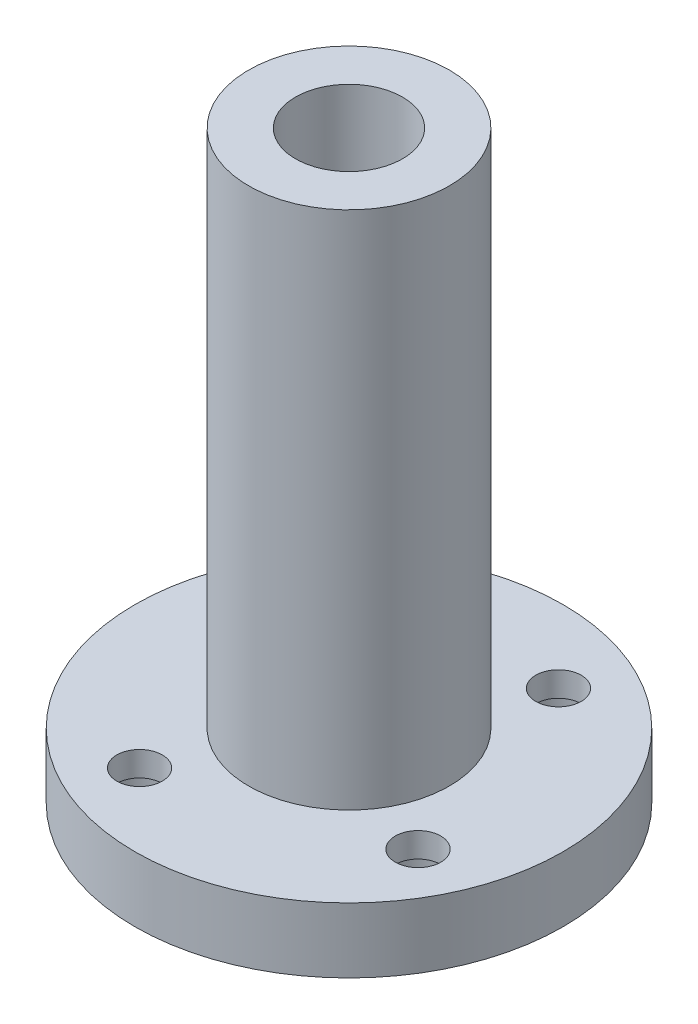
ISO-10303-21;
HEADER;
FILE_DESCRIPTION(('STEP AP214'),'2;1');
FILE_NAME('part.step','',(''),(''),'','','');
FILE_SCHEMA(('AUTOMOTIVE_DESIGN { 1 0 10303 214 1 1 1 1 }'));
ENDSEC;
DATA;
#1=APPLICATION_CONTEXT('core data for automotive mechanical design processes');
#2=APPLICATION_PROTOCOL_DEFINITION('international standard','automotive_design',2000,#1);
#3=PRODUCT_CONTEXT('',#1,'mechanical');
#4=PRODUCT('Part','Part','',(#3));
#5=PRODUCT_RELATED_PRODUCT_CATEGORY('part','',(#4));
#6=PRODUCT_DEFINITION_FORMATION('','',#4);
#7=PRODUCT_DEFINITION_CONTEXT('part definition',#1,'design');
#8=PRODUCT_DEFINITION('design','',#6,#7);
#9=PRODUCT_DEFINITION_SHAPE('','',#8);
#10=(LENGTH_UNIT() NAMED_UNIT(*) SI_UNIT(.MILLI.,.METRE.));
#11=(NAMED_UNIT(*) PLANE_ANGLE_UNIT() SI_UNIT($,.RADIAN.));
#12=(NAMED_UNIT(*) SI_UNIT($,.STERADIAN.) SOLID_ANGLE_UNIT());
#13=UNCERTAINTY_MEASURE_WITH_UNIT(LENGTH_MEASURE(1.E-05),#10,'distance_accuracy_value','');
#14=(GEOMETRIC_REPRESENTATION_CONTEXT(3) GLOBAL_UNCERTAINTY_ASSIGNED_CONTEXT((#13)) GLOBAL_UNIT_ASSIGNED_CONTEXT((#10,
#11,#12)) REPRESENTATION_CONTEXT('',''));
#15=CARTESIAN_POINT('',(0.,0.,0.));
#16=DIRECTION('',(0.,0.,1.));
#17=DIRECTION('',(1.,0.,0.));
#18=AXIS2_PLACEMENT_3D('',#15,#16,#17);
#19=CARTESIAN_POINT('',(-5.40292214632431,5.,10.7148696809974));
#20=DIRECTION('',(0.,-1.,0.));
#21=DIRECTION('',(0.,0.,-1.));
#22=AXIS2_PLACEMENT_3D('',#19,#20,#21);
#23=CYLINDRICAL_SURFACE('',#22,1.75);
#24=CARTESIAN_POINT('',(-5.40292214632431,5.,10.7148696809974));
#25=DIRECTION('',(0.,1.,0.));
#26=DIRECTION('',(0.,0.,1.));
#27=AXIS2_PLACEMENT_3D('',#24,#25,#26);
#28=CIRCLE('',#27,1.75);
#29=CARTESIAN_POINT('',(-5.40292214632431,5.,12.4648696809974));
#30=VERTEX_POINT('',#29);
#31=EDGE_CURVE('E49',#30,#30,#28,.T.);
#32=ORIENTED_EDGE('',*,*,#31,.T.);
#33=EDGE_LOOP('',(#32));
#34=FACE_BOUND('',#33,.T.);
#35=CARTESIAN_POINT('',(-5.40292214632431,3.1,10.7148696809974));
#36=DIRECTION('',(0.,-1.,0.));
#37=DIRECTION('',(0.,0.,-1.));
#38=AXIS2_PLACEMENT_3D('',#35,#36,#37);
#39=CIRCLE('',#38,1.75);
#40=CARTESIAN_POINT('',(-5.40292214632431,3.1,8.96486968099745));
#41=VERTEX_POINT('',#40);
#42=EDGE_CURVE('E40',#41,#41,#39,.T.);
#43=ORIENTED_EDGE('',*,*,#42,.T.);
#44=EDGE_LOOP('',(#43));
#45=FACE_BOUND('',#44,.T.);
#46=ADVANCED_FACE('F36',(#34,#45),#23,.F.);
#47=CARTESIAN_POINT('',(-10.7148696809974,5.,-5.40292214632435));
#48=DIRECTION('',(0.,-1.,0.));
#49=DIRECTION('',(0.,0.,-1.));
#50=AXIS2_PLACEMENT_3D('',#47,#48,#49);
#51=CYLINDRICAL_SURFACE('',#50,1.75);
#52=CARTESIAN_POINT('',(-10.7148696809974,5.,-5.40292214632435));
#53=DIRECTION('',(0.,1.,0.));
#54=DIRECTION('',(0.,0.,1.));
#55=AXIS2_PLACEMENT_3D('',#52,#53,#54);
#56=CIRCLE('',#55,1.75);
#57=CARTESIAN_POINT('',(-10.7148696809974,5.,-3.65292214632435));
#58=VERTEX_POINT('',#57);
#59=EDGE_CURVE('E86',#58,#58,#56,.T.);
#60=ORIENTED_EDGE('',*,*,#59,.T.);
#61=EDGE_LOOP('',(#60));
#62=FACE_BOUND('',#61,.T.);
#63=CARTESIAN_POINT('',(-10.7148696809974,3.1,-5.40292214632435));
#64=DIRECTION('',(0.,-1.,0.));
#65=DIRECTION('',(0.,0.,-1.));
#66=AXIS2_PLACEMENT_3D('',#63,#64,#65);
#67=CIRCLE('',#66,1.75);
#68=CARTESIAN_POINT('',(-10.7148696809974,3.1,-7.15292214632435));
#69=VERTEX_POINT('',#68);
#70=EDGE_CURVE('E64',#69,#69,#67,.T.);
#71=ORIENTED_EDGE('',*,*,#70,.T.);
#72=EDGE_LOOP('',(#71));
#73=FACE_BOUND('',#72,.T.);
#74=ADVANCED_FACE('F122',(#62,#73),#51,.F.);
#75=CARTESIAN_POINT('',(5.40292214632439,5.,-10.7148696809974));
#76=DIRECTION('',(0.,-1.,0.));
#77=DIRECTION('',(0.,0.,-1.));
#78=AXIS2_PLACEMENT_3D('',#75,#76,#77);
#79=CYLINDRICAL_SURFACE('',#78,1.75);
#80=CARTESIAN_POINT('',(5.40292214632439,5.,-10.7148696809974));
#81=DIRECTION('',(0.,1.,0.));
#82=DIRECTION('',(0.,0.,1.));
#83=AXIS2_PLACEMENT_3D('',#80,#81,#82);
#84=CIRCLE('',#83,1.75);
#85=CARTESIAN_POINT('',(5.40292214632439,5.,-8.96486968099741));
#86=VERTEX_POINT('',#85);
#87=EDGE_CURVE('E83',#86,#86,#84,.T.);
#88=ORIENTED_EDGE('',*,*,#87,.T.);
#89=EDGE_LOOP('',(#88));
#90=FACE_BOUND('',#89,.T.);
#91=CARTESIAN_POINT('',(5.40292214632439,3.1,-10.7148696809974));
#92=DIRECTION('',(0.,-1.,0.));
#93=DIRECTION('',(0.,0.,-1.));
#94=AXIS2_PLACEMENT_3D('',#91,#92,#93);
#95=CIRCLE('',#94,1.75);
#96=CARTESIAN_POINT('',(5.40292214632439,3.1,-12.4648696809974));
#97=VERTEX_POINT('',#96);
#98=EDGE_CURVE('E61',#97,#97,#95,.T.);
#99=ORIENTED_EDGE('',*,*,#98,.T.);
#100=EDGE_LOOP('',(#99));
#101=FACE_BOUND('',#100,.T.);
#102=ADVANCED_FACE('F127',(#90,#101),#79,.F.);
#103=CARTESIAN_POINT('',(10.7148696809974,5.,5.40292214632442));
#104=DIRECTION('',(0.,-1.,0.));
#105=DIRECTION('',(0.,0.,-1.));
#106=AXIS2_PLACEMENT_3D('',#103,#104,#105);
#107=CYLINDRICAL_SURFACE('',#106,1.75);
#108=CARTESIAN_POINT('',(10.7148696809974,5.,5.40292214632442));
#109=DIRECTION('',(0.,1.,0.));
#110=DIRECTION('',(0.,0.,1.));
#111=AXIS2_PLACEMENT_3D('',#108,#109,#110);
#112=CIRCLE('',#111,1.75);
#113=CARTESIAN_POINT('',(10.7148696809974,5.,7.15292214632442));
#114=VERTEX_POINT('',#113);
#115=EDGE_CURVE('E56',#114,#114,#112,.T.);
#116=ORIENTED_EDGE('',*,*,#115,.T.);
#117=EDGE_LOOP('',(#116));
#118=FACE_BOUND('',#117,.T.);
#119=CARTESIAN_POINT('',(10.7148696809974,3.1,5.40292214632442));
#120=DIRECTION('',(0.,-1.,0.));
#121=DIRECTION('',(0.,0.,-1.));
#122=AXIS2_PLACEMENT_3D('',#119,#120,#121);
#123=CIRCLE('',#122,1.75);
#124=CARTESIAN_POINT('',(10.7148696809974,3.1,3.65292214632442));
#125=VERTEX_POINT('',#124);
#126=EDGE_CURVE('E58',#125,#125,#123,.T.);
#127=ORIENTED_EDGE('',*,*,#126,.T.);
#128=EDGE_LOOP('',(#127));
#129=FACE_BOUND('',#128,.T.);
#130=ADVANCED_FACE('F38',(#118,#129),#107,.F.);
#131=CARTESIAN_POINT('',(0.,5.,0.));
#132=DIRECTION('',(0.,-1.,0.));
#133=DIRECTION('',(0.,0.,-1.));
#134=AXIS2_PLACEMENT_3D('',#131,#132,#133);
#135=CYLINDRICAL_SURFACE('',#134,16.4742623798339);
#136=CARTESIAN_POINT('',(0.,5.,0.));
#137=DIRECTION('',(0.,1.,0.));
#138=DIRECTION('',(0.,0.,1.));
#139=AXIS2_PLACEMENT_3D('',#136,#137,#138);
#140=CIRCLE('',#139,16.4742623798339);
#141=CARTESIAN_POINT('',(0.,5.,16.4742623798339));
#142=VERTEX_POINT('',#141);
#143=EDGE_CURVE('E10',#142,#142,#140,.T.);
#144=ORIENTED_EDGE('',*,*,#143,.F.);
#145=EDGE_LOOP('',(#144));
#146=FACE_BOUND('',#145,.T.);
#147=CARTESIAN_POINT('',(0.,0.,0.));
#148=DIRECTION('',(0.,1.,0.));
#149=DIRECTION('',(0.,0.,1.));
#150=AXIS2_PLACEMENT_3D('',#147,#148,#149);
#151=CIRCLE('',#150,16.4742623798339);
#152=CARTESIAN_POINT('',(0.,0.,16.4742623798339));
#153=VERTEX_POINT('',#152);
#154=EDGE_CURVE('E53',#153,#153,#151,.T.);
#155=ORIENTED_EDGE('',*,*,#154,.T.);
#156=EDGE_LOOP('',(#155));
#157=FACE_BOUND('',#156,.T.);
#158=ADVANCED_FACE('F96',(#146,#157),#135,.T.);
#159=CARTESIAN_POINT('',(0.,5.,0.));
#160=DIRECTION('',(0.,1.,0.));
#161=DIRECTION('',(0.,0.,1.));
#162=AXIS2_PLACEMENT_3D('',#159,#160,#161);
#163=PLANE('',#162);
#164=ORIENTED_EDGE('',*,*,#115,.F.);
#165=EDGE_LOOP('',(#164));
#166=FACE_BOUND('',#165,.T.);
#167=ORIENTED_EDGE('',*,*,#87,.F.);
#168=EDGE_LOOP('',(#167));
#169=FACE_BOUND('',#168,.T.);
#170=ORIENTED_EDGE('',*,*,#59,.F.);
#171=EDGE_LOOP('',(#170));
#172=FACE_BOUND('',#171,.T.);
#173=ORIENTED_EDGE('',*,*,#31,.F.);
#174=EDGE_LOOP('',(#173));
#175=FACE_BOUND('',#174,.T.);
#176=CARTESIAN_POINT('',(0.,5.,0.));
#177=DIRECTION('',(0.,1.,0.));
#178=DIRECTION('',(0.,0.,1.));
#179=AXIS2_PLACEMENT_3D('',#176,#177,#178);
#180=CIRCLE('',#179,7.72231049054715);
#181=CARTESIAN_POINT('',(0.,5.,-7.72231049054715));
#182=VERTEX_POINT('',#181);
#183=EDGE_CURVE('E44',#182,#182,#180,.T.);
#184=ORIENTED_EDGE('',*,*,#183,.F.);
#185=EDGE_LOOP('',(#184));
#186=FACE_BOUND('',#185,.T.);
#187=ORIENTED_EDGE('',*,*,#143,.T.);
#188=EDGE_LOOP('',(#187));
#189=FACE_BOUND('',#188,.T.);
#190=ADVANCED_FACE('F92',(#166,#169,#172,#175,#186,#189),#163,.T.);
#191=CARTESIAN_POINT('',(0.,0.,0.));
#192=DIRECTION('',(0.,1.,0.));
#193=DIRECTION('',(0.,0.,1.));
#194=AXIS2_PLACEMENT_3D('',#191,#192,#193);
#195=PLANE('',#194);
#196=CARTESIAN_POINT('',(10.7148696809975,0.,5.40292214632427));
#197=DIRECTION('',(0.,-1.,0.));
#198=DIRECTION('',(0.,0.,-1.));
#199=AXIS2_PLACEMENT_3D('',#196,#197,#198);
#200=CIRCLE('',#199,3.);
#201=CARTESIAN_POINT('',(10.7148696809975,0.,2.40292214632427));
#202=VERTEX_POINT('',#201);
#203=EDGE_CURVE('E154',#202,#202,#200,.T.);
#204=ORIENTED_EDGE('',*,*,#203,.F.);
#205=EDGE_LOOP('',(#204));
#206=FACE_BOUND('',#205,.T.);
#207=CARTESIAN_POINT('',(-5.40292214632431,0.,10.7148696809974));
#208=DIRECTION('',(0.,-1.,0.));
#209=DIRECTION('',(0.,0.,-1.));
#210=AXIS2_PLACEMENT_3D('',#207,#208,#209);
#211=CIRCLE('',#210,3.);
#212=CARTESIAN_POINT('',(-5.40292214632431,0.,7.71486968099745));
#213=VERTEX_POINT('',#212);
#214=EDGE_CURVE('E160',#213,#213,#211,.T.);
#215=ORIENTED_EDGE('',*,*,#214,.F.);
#216=EDGE_LOOP('',(#215));
#217=FACE_BOUND('',#216,.T.);
#218=CARTESIAN_POINT('',(-10.7148696809974,0.,-5.40292214632434));
#219=DIRECTION('',(0.,-1.,0.));
#220=DIRECTION('',(0.,0.,-1.));
#221=AXIS2_PLACEMENT_3D('',#218,#219,#220);
#222=CIRCLE('',#221,3.);
#223=CARTESIAN_POINT('',(-10.7148696809974,0.,-8.40292214632434));
#224=VERTEX_POINT('',#223);
#225=EDGE_CURVE('E166',#224,#224,#222,.T.);
#226=ORIENTED_EDGE('',*,*,#225,.F.);
#227=EDGE_LOOP('',(#226));
#228=FACE_BOUND('',#227,.T.);
#229=CARTESIAN_POINT('',(5.40292214632439,0.,-10.7148696809974));
#230=DIRECTION('',(0.,-1.,0.));
#231=DIRECTION('',(0.,0.,-1.));
#232=AXIS2_PLACEMENT_3D('',#229,#230,#231);
#233=CIRCLE('',#232,3.);
#234=CARTESIAN_POINT('',(5.40292214632439,0.,-13.7148696809974));
#235=VERTEX_POINT('',#234);
#236=EDGE_CURVE('E148',#235,#235,#233,.T.);
#237=ORIENTED_EDGE('',*,*,#236,.F.);
#238=EDGE_LOOP('',(#237));
#239=FACE_BOUND('',#238,.T.);
#240=ORIENTED_EDGE('',*,*,#154,.F.);
#241=EDGE_LOOP('',(#240));
#242=FACE_BOUND('',#241,.T.);
#243=CARTESIAN_POINT('',(0.,0.,0.));
#244=DIRECTION('',(0.,1.,0.));
#245=DIRECTION('',(0.,0.,1.));
#246=AXIS2_PLACEMENT_3D('',#243,#244,#245);
#247=CIRCLE('',#246,4.11856559495848);
#248=CARTESIAN_POINT('',(0.,0.,-4.11856559495848));
#249=VERTEX_POINT('',#248);
#250=EDGE_CURVE('E69',#249,#249,#247,.T.);
#251=ORIENTED_EDGE('',*,*,#250,.T.);
#252=EDGE_LOOP('',(#251));
#253=FACE_BOUND('',#252,.T.);
#254=ADVANCED_FACE('F95',(#206,#217,#228,#239,#242,#253),#195,.F.);
#255=CARTESIAN_POINT('',(0.,45.,0.));
#256=DIRECTION('',(0.,-1.,0.));
#257=DIRECTION('',(0.,0.,-1.));
#258=AXIS2_PLACEMENT_3D('',#255,#256,#257);
#259=CYLINDRICAL_SURFACE('',#258,4.11856559495848);
#260=CARTESIAN_POINT('',(0.,45.,0.));
#261=DIRECTION('',(0.,1.,0.));
#262=DIRECTION('',(0.,0.,1.));
#263=AXIS2_PLACEMENT_3D('',#260,#261,#262);
#264=CIRCLE('',#263,4.11856559495848);
#265=CARTESIAN_POINT('',(0.,45.,-4.11856559495848));
#266=VERTEX_POINT('',#265);
#267=EDGE_CURVE('E73',#266,#266,#264,.T.);
#268=CARTESIAN_POINT('',(0.,45.,-4.11856559495848));
#269=CARTESIAN_POINT('',(0.,44.53125,-4.11856559495848));
#270=CARTESIAN_POINT('',(0.,44.0625,-4.11856559495848));
#271=CARTESIAN_POINT('',(0.,43.125,-4.11856559495848));
#272=CARTESIAN_POINT('',(0.,42.65625,-4.11856559495848));
#273=CARTESIAN_POINT('',(0.,41.71875,-4.11856559495848));
#274=CARTESIAN_POINT('',(0.,41.25,-4.11856559495848));
#275=CARTESIAN_POINT('',(0.,40.3125,-4.11856559495848));
#276=CARTESIAN_POINT('',(0.,39.84375,-4.11856559495848));
#277=CARTESIAN_POINT('',(0.,38.90625,-4.11856559495848));
#278=CARTESIAN_POINT('',(0.,38.4375,-4.11856559495848));
#279=CARTESIAN_POINT('',(0.,37.5,-4.11856559495848));
#280=CARTESIAN_POINT('',(0.,37.03125,-4.11856559495848));
#281=CARTESIAN_POINT('',(0.,36.09375,-4.11856559495848));
#282=CARTESIAN_POINT('',(0.,35.625,-4.11856559495848));
#283=CARTESIAN_POINT('',(0.,34.6875,-4.11856559495848));
#284=CARTESIAN_POINT('',(0.,34.21875,-4.11856559495848));
#285=CARTESIAN_POINT('',(0.,33.28125,-4.11856559495848));
#286=CARTESIAN_POINT('',(0.,32.8125,-4.11856559495848));
#287=CARTESIAN_POINT('',(0.,31.875,-4.11856559495848));
#288=CARTESIAN_POINT('',(0.,31.40625,-4.11856559495848));
#289=CARTESIAN_POINT('',(0.,30.46875,-4.11856559495848));
#290=CARTESIAN_POINT('',(0.,30.,-4.11856559495848));
#291=CARTESIAN_POINT('',(0.,29.0625,-4.11856559495848));
#292=CARTESIAN_POINT('',(0.,28.59375,-4.11856559495848));
#293=CARTESIAN_POINT('',(0.,27.65625,-4.11856559495848));
#294=CARTESIAN_POINT('',(0.,27.1875,-4.11856559495848));
#295=CARTESIAN_POINT('',(0.,26.25,-4.11856559495848));
#296=CARTESIAN_POINT('',(0.,25.78125,-4.11856559495848));
#297=CARTESIAN_POINT('',(0.,24.84375,-4.11856559495848));
#298=CARTESIAN_POINT('',(0.,24.375,-4.11856559495848));
#299=CARTESIAN_POINT('',(0.,23.4375,-4.11856559495848));
#300=CARTESIAN_POINT('',(0.,22.96875,-4.11856559495848));
#301=CARTESIAN_POINT('',(0.,22.03125,-4.11856559495848));
#302=CARTESIAN_POINT('',(0.,21.5625,-4.11856559495848));
#303=CARTESIAN_POINT('',(0.,20.625,-4.11856559495848));
#304=CARTESIAN_POINT('',(0.,20.15625,-4.11856559495848));
#305=CARTESIAN_POINT('',(0.,19.21875,-4.11856559495848));
#306=CARTESIAN_POINT('',(0.,18.75,-4.11856559495848));
#307=CARTESIAN_POINT('',(0.,17.8125,-4.11856559495848));
#308=CARTESIAN_POINT('',(0.,17.34375,-4.11856559495848));
#309=CARTESIAN_POINT('',(0.,16.40625,-4.11856559495848));
#310=CARTESIAN_POINT('',(0.,15.9375,-4.11856559495848));
#311=CARTESIAN_POINT('',(0.,15.,-4.11856559495848));
#312=CARTESIAN_POINT('',(0.,14.53125,-4.11856559495848));
#313=CARTESIAN_POINT('',(0.,13.59375,-4.11856559495848));
#314=CARTESIAN_POINT('',(0.,13.125,-4.11856559495848));
#315=CARTESIAN_POINT('',(0.,12.1875,-4.11856559495848));
#316=CARTESIAN_POINT('',(0.,11.71875,-4.11856559495848));
#317=CARTESIAN_POINT('',(0.,10.78125,-4.11856559495848));
#318=CARTESIAN_POINT('',(0.,10.3125,-4.11856559495848));
#319=CARTESIAN_POINT('',(0.,9.37499999999999,-4.11856559495848));
#320=CARTESIAN_POINT('',(0.,8.90624999999999,-4.11856559495848));
#321=CARTESIAN_POINT('',(0.,7.96874999999999,-4.11856559495848));
#322=CARTESIAN_POINT('',(0.,7.5,-4.11856559495848));
#323=CARTESIAN_POINT('',(0.,6.56249999999999,-4.11856559495848));
#324=CARTESIAN_POINT('',(0.,6.09374999999999,-4.11856559495848));
#325=CARTESIAN_POINT('',(0.,5.15624999999999,-4.11856559495848));
#326=CARTESIAN_POINT('',(0.,4.68749999999999,-4.11856559495848));
#327=CARTESIAN_POINT('',(0.,3.74999999999999,-4.11856559495848));
#328=CARTESIAN_POINT('',(0.,3.28124999999999,-4.11856559495848));
#329=CARTESIAN_POINT('',(0.,2.34374999999999,-4.11856559495848));
#330=CARTESIAN_POINT('',(0.,1.87499999999999,-4.11856559495848));
#331=CARTESIAN_POINT('',(0.,0.937499999999992,-4.11856559495848));
#332=CARTESIAN_POINT('',(0.,0.468749999999993,-4.11856559495848));
#333=CARTESIAN_POINT('',(0.,0.,-4.11856559495848));
#334=B_SPLINE_CURVE_WITH_KNOTS('',3,(#268,#269,#270,#271,#272,#273,#274,#275,#276,#277,#278,
#279,#280,#281,#282,#283,#284,#285,#286,#287,#288,#289,#290,#291,#292,#293,#294,#295,#296,#297,
#298,#299,#300,#301,#302,#303,#304,#305,#306,#307,#308,#309,#310,#311,#312,#313,#314,#315,#316,
#317,#318,#319,#320,#321,#322,#323,#324,#325,#326,#327,#328,#329,#330,#331,#332,#333),
.UNSPECIFIED.,.F.,.F.,(4,2,2,2,2,2,2,2,2,2,2,2,2,2,2,2,2,2,2,2,2,2,2,2,2,2,2,2,2,2,2,2,4),(0.,
1.40625,2.8125,4.21874999999999,5.625,7.03125,8.43749999999999,9.84375,11.25,12.65625,14.0625,
15.46875,16.875,18.28125,19.6875,21.09375,22.5,23.90625,25.3125,26.71875,28.125,29.53125,
30.9375,32.34375,33.75,35.15625,36.5625,37.96875,39.375,40.78125,42.1875,43.59375,45.),.UNSPECIFIED.);
#335=EDGE_CURVE('BSEAM105',#266,#249,#334,.T.);
#336=ORIENTED_EDGE('',*,*,#267,.T.);
#337=ORIENTED_EDGE('',*,*,#250,.F.);
#338=ORIENTED_EDGE('',*,*,#335,.T.);
#339=ORIENTED_EDGE('',*,*,#335,.F.);
#340=EDGE_LOOP('',(#336,#338,#337,#339));
#341=FACE_BOUND('',#340,.T.);
#342=ADVANCED_FACE('F105',(#341),#259,.F.);
#343=CARTESIAN_POINT('',(0.,45.,0.));
#344=DIRECTION('',(0.,-1.,0.));
#345=DIRECTION('',(0.,0.,-1.));
#346=AXIS2_PLACEMENT_3D('',#343,#344,#345);
#347=CYLINDRICAL_SURFACE('',#346,7.72231049054715);
#348=CARTESIAN_POINT('',(0.,45.,0.));
#349=DIRECTION('',(0.,1.,0.));
#350=DIRECTION('',(0.,0.,1.));
#351=AXIS2_PLACEMENT_3D('',#348,#349,#350);
#352=CIRCLE('',#351,7.72231049054715);
#353=CARTESIAN_POINT('',(0.,45.,-7.72231049054715));
#354=VERTEX_POINT('',#353);
#355=EDGE_CURVE('E57',#354,#354,#352,.T.);
#356=CARTESIAN_POINT('',(0.,5.,-7.72231049054715));
#357=CARTESIAN_POINT('',(0.,5.41666666666666,-7.72231049054715));
#358=CARTESIAN_POINT('',(0.,5.83333333333333,-7.72231049054715));
#359=CARTESIAN_POINT('',(0.,6.66666666666667,-7.72231049054715));
#360=CARTESIAN_POINT('',(0.,7.08333333333333,-7.72231049054715));
#361=CARTESIAN_POINT('',(0.,7.91666666666667,-7.72231049054715));
#362=CARTESIAN_POINT('',(0.,8.33333333333333,-7.72231049054715));
#363=CARTESIAN_POINT('',(0.,9.16666666666666,-7.72231049054715));
#364=CARTESIAN_POINT('',(0.,9.58333333333333,-7.72231049054715));
#365=CARTESIAN_POINT('',(0.,10.4166666666667,-7.72231049054715));
#366=CARTESIAN_POINT('',(0.,10.8333333333333,-7.72231049054715));
#367=CARTESIAN_POINT('',(0.,11.6666666666667,-7.72231049054715));
#368=CARTESIAN_POINT('',(0.,12.0833333333333,-7.72231049054715));
#369=CARTESIAN_POINT('',(0.,12.9166666666667,-7.72231049054715));
#370=CARTESIAN_POINT('',(0.,13.3333333333333,-7.72231049054715));
#371=CARTESIAN_POINT('',(0.,14.1666666666667,-7.72231049054715));
#372=CARTESIAN_POINT('',(0.,14.5833333333333,-7.72231049054715));
#373=CARTESIAN_POINT('',(0.,15.4166666666667,-7.72231049054715));
#374=CARTESIAN_POINT('',(0.,15.8333333333333,-7.72231049054715));
#375=CARTESIAN_POINT('',(0.,16.6666666666667,-7.72231049054715));
#376=CARTESIAN_POINT('',(0.,17.0833333333333,-7.72231049054715));
#377=CARTESIAN_POINT('',(0.,17.9166666666667,-7.72231049054715));
#378=CARTESIAN_POINT('',(0.,18.3333333333333,-7.72231049054715));
#379=CARTESIAN_POINT('',(0.,19.1666666666667,-7.72231049054715));
#380=CARTESIAN_POINT('',(0.,19.5833333333333,-7.72231049054715));
#381=CARTESIAN_POINT('',(0.,20.4166666666667,-7.72231049054715));
#382=CARTESIAN_POINT('',(0.,20.8333333333333,-7.72231049054715));
#383=CARTESIAN_POINT('',(0.,21.6666666666667,-7.72231049054715));
#384=CARTESIAN_POINT('',(0.,22.0833333333333,-7.72231049054715));
#385=CARTESIAN_POINT('',(0.,22.9166666666667,-7.72231049054715));
#386=CARTESIAN_POINT('',(0.,23.3333333333333,-7.72231049054715));
#387=CARTESIAN_POINT('',(0.,24.1666666666667,-7.72231049054715));
#388=CARTESIAN_POINT('',(0.,24.5833333333333,-7.72231049054715));
#389=CARTESIAN_POINT('',(0.,25.4166666666667,-7.72231049054715));
#390=CARTESIAN_POINT('',(0.,25.8333333333333,-7.72231049054715));
#391=CARTESIAN_POINT('',(0.,26.6666666666667,-7.72231049054715));
#392=CARTESIAN_POINT('',(0.,27.0833333333333,-7.72231049054715));
#393=CARTESIAN_POINT('',(0.,27.9166666666667,-7.72231049054715));
#394=CARTESIAN_POINT('',(0.,28.3333333333333,-7.72231049054715));
#395=CARTESIAN_POINT('',(0.,29.1666666666667,-7.72231049054715));
#396=CARTESIAN_POINT('',(0.,29.5833333333333,-7.72231049054715));
#397=CARTESIAN_POINT('',(0.,30.4166666666667,-7.72231049054715));
#398=CARTESIAN_POINT('',(0.,30.8333333333333,-7.72231049054715));
#399=CARTESIAN_POINT('',(0.,31.6666666666667,-7.72231049054715));
#400=CARTESIAN_POINT('',(0.,32.0833333333333,-7.72231049054715));
#401=CARTESIAN_POINT('',(0.,32.9166666666667,-7.72231049054715));
#402=CARTESIAN_POINT('',(0.,33.3333333333333,-7.72231049054715));
#403=CARTESIAN_POINT('',(0.,34.1666666666667,-7.72231049054715));
#404=CARTESIAN_POINT('',(0.,34.5833333333333,-7.72231049054715));
#405=CARTESIAN_POINT('',(0.,35.4166666666667,-7.72231049054715));
#406=CARTESIAN_POINT('',(0.,35.8333333333333,-7.72231049054715));
#407=CARTESIAN_POINT('',(0.,36.6666666666667,-7.72231049054715));
#408=CARTESIAN_POINT('',(0.,37.0833333333333,-7.72231049054715));
#409=CARTESIAN_POINT('',(0.,37.9166666666667,-7.72231049054715));
#410=CARTESIAN_POINT('',(0.,38.3333333333333,-7.72231049054715));
#411=CARTESIAN_POINT('',(0.,39.1666666666667,-7.72231049054715));
#412=CARTESIAN_POINT('',(0.,39.5833333333333,-7.72231049054715));
#413=CARTESIAN_POINT('',(0.,40.4166666666667,-7.72231049054715));
#414=CARTESIAN_POINT('',(0.,40.8333333333333,-7.72231049054715));
#415=CARTESIAN_POINT('',(0.,41.6666666666667,-7.72231049054715));
#416=CARTESIAN_POINT('',(0.,42.0833333333333,-7.72231049054715));
#417=CARTESIAN_POINT('',(0.,42.9166666666667,-7.72231049054715));
#418=CARTESIAN_POINT('',(0.,43.3333333333333,-7.72231049054715));
#419=CARTESIAN_POINT('',(0.,44.1666666666667,-7.72231049054715));
#420=CARTESIAN_POINT('',(0.,44.5833333333333,-7.72231049054715));
#421=CARTESIAN_POINT('',(0.,45.,-7.72231049054715));
#422=B_SPLINE_CURVE_WITH_KNOTS('',3,(#356,#357,#358,#359,#360,#361,#362,#363,#364,#365,#366,
#367,#368,#369,#370,#371,#372,#373,#374,#375,#376,#377,#378,#379,#380,#381,#382,#383,#384,#385,
#386,#387,#388,#389,#390,#391,#392,#393,#394,#395,#396,#397,#398,#399,#400,#401,#402,#403,#404,
#405,#406,#407,#408,#409,#410,#411,#412,#413,#414,#415,#416,#417,#418,#419,#420,#421),
.UNSPECIFIED.,.F.,.F.,(4,2,2,2,2,2,2,2,2,2,2,2,2,2,2,2,2,2,2,2,2,2,2,2,2,2,2,2,2,2,2,2,4),(0.,
1.25,2.5,3.75,5.,6.25,7.5,8.75,10.,11.25,12.5,13.75,15.,16.25,17.5,18.75,20.,21.25,22.5,23.75,
25.,26.25,27.5,28.75,30.,31.25,32.5,33.75,35.,36.25,37.5,38.75,40.),.UNSPECIFIED.);
#423=EDGE_CURVE('BSEAM101',#182,#354,#422,.T.);
#424=ORIENTED_EDGE('',*,*,#183,.T.);
#425=ORIENTED_EDGE('',*,*,#355,.F.);
#426=ORIENTED_EDGE('',*,*,#423,.T.);
#427=ORIENTED_EDGE('',*,*,#423,.F.);
#428=EDGE_LOOP('',(#424,#426,#425,#427));
#429=FACE_BOUND('',#428,.T.);
#430=ADVANCED_FACE('F101',(#429),#347,.T.);
#431=CARTESIAN_POINT('',(0.,45.,0.));
#432=DIRECTION('',(0.,1.,0.));
#433=DIRECTION('',(0.,0.,1.));
#434=AXIS2_PLACEMENT_3D('',#431,#432,#433);
#435=PLANE('',#434);
#436=ORIENTED_EDGE('',*,*,#267,.F.);
#437=EDGE_LOOP('',(#436));
#438=FACE_BOUND('',#437,.T.);
#439=ORIENTED_EDGE('',*,*,#355,.T.);
#440=EDGE_LOOP('',(#439));
#441=FACE_BOUND('',#440,.T.);
#442=ADVANCED_FACE('F104',(#438,#441),#435,.T.);
#443=CARTESIAN_POINT('',(5.40292214632439,3.1,-10.7148696809974));
#444=DIRECTION('',(0.,-1.,0.));
#445=DIRECTION('',(0.,0.,-1.));
#446=AXIS2_PLACEMENT_3D('',#443,#444,#445);
#447=CYLINDRICAL_SURFACE('',#446,3.);
#448=CARTESIAN_POINT('',(5.40292214632439,3.1,-10.7148696809974));
#449=DIRECTION('',(0.,-1.,0.));
#450=DIRECTION('',(0.,0.,-1.));
#451=AXIS2_PLACEMENT_3D('',#448,#449,#450);
#452=CIRCLE('',#451,3.);
#453=CARTESIAN_POINT('',(5.40292214632439,3.1,-13.7148696809974));
#454=VERTEX_POINT('',#453);
#455=EDGE_CURVE('E62',#454,#454,#452,.T.);
#456=CARTESIAN_POINT('',(5.40292214632439,3.1,-13.7148696809974));
#457=CARTESIAN_POINT('',(5.40292214632439,3.06770833333333,-13.7148696809974));
#458=CARTESIAN_POINT('',(5.40292214632439,3.03541666666667,-13.7148696809974));
#459=CARTESIAN_POINT('',(5.40292214632439,2.97083333333333,-13.7148696809974));
#460=CARTESIAN_POINT('',(5.40292214632439,2.93854166666667,-13.7148696809974));
#461=CARTESIAN_POINT('',(5.40292214632439,2.87395833333333,-13.7148696809974));
#462=CARTESIAN_POINT('',(5.40292214632439,2.84166666666667,-13.7148696809974));
#463=CARTESIAN_POINT('',(5.40292214632439,2.77708333333333,-13.7148696809974));
#464=CARTESIAN_POINT('',(5.40292214632439,2.74479166666667,-13.7148696809974));
#465=CARTESIAN_POINT('',(5.40292214632439,2.68020833333333,-13.7148696809974));
#466=CARTESIAN_POINT('',(5.40292214632439,2.64791666666667,-13.7148696809974));
#467=CARTESIAN_POINT('',(5.40292214632439,2.58333333333333,-13.7148696809974));
#468=CARTESIAN_POINT('',(5.40292214632439,2.55104166666667,-13.7148696809974));
#469=CARTESIAN_POINT('',(5.40292214632439,2.48645833333333,-13.7148696809974));
#470=CARTESIAN_POINT('',(5.40292214632439,2.45416666666667,-13.7148696809974));
#471=CARTESIAN_POINT('',(5.40292214632439,2.38958333333333,-13.7148696809974));
#472=CARTESIAN_POINT('',(5.40292214632439,2.35729166666667,-13.7148696809974));
#473=CARTESIAN_POINT('',(5.40292214632439,2.29270833333333,-13.7148696809974));
#474=CARTESIAN_POINT('',(5.40292214632439,2.26041666666667,-13.7148696809974));
#475=CARTESIAN_POINT('',(5.40292214632439,2.19583333333333,-13.7148696809974));
#476=CARTESIAN_POINT('',(5.40292214632439,2.16354166666667,-13.7148696809974));
#477=CARTESIAN_POINT('',(5.40292214632439,2.09895833333333,-13.7148696809974));
#478=CARTESIAN_POINT('',(5.40292214632439,2.06666666666667,-13.7148696809974));
#479=CARTESIAN_POINT('',(5.40292214632439,2.00208333333333,-13.7148696809974));
#480=CARTESIAN_POINT('',(5.40292214632439,1.96979166666667,-13.7148696809974));
#481=CARTESIAN_POINT('',(5.40292214632439,1.90520833333333,-13.7148696809974));
#482=CARTESIAN_POINT('',(5.40292214632439,1.87291666666667,-13.7148696809974));
#483=CARTESIAN_POINT('',(5.40292214632439,1.80833333333333,-13.7148696809974));
#484=CARTESIAN_POINT('',(5.40292214632439,1.77604166666667,-13.7148696809974));
#485=CARTESIAN_POINT('',(5.40292214632439,1.71145833333333,-13.7148696809974));
#486=CARTESIAN_POINT('',(5.40292214632439,1.67916666666667,-13.7148696809974));
#487=CARTESIAN_POINT('',(5.40292214632439,1.61458333333333,-13.7148696809974));
#488=CARTESIAN_POINT('',(5.40292214632439,1.58229166666667,-13.7148696809974));
#489=CARTESIAN_POINT('',(5.40292214632439,1.51770833333333,-13.7148696809974));
#490=CARTESIAN_POINT('',(5.40292214632439,1.48541666666667,-13.7148696809974));
#491=CARTESIAN_POINT('',(5.40292214632439,1.42083333333333,-13.7148696809974));
#492=CARTESIAN_POINT('',(5.40292214632439,1.38854166666667,-13.7148696809974));
#493=CARTESIAN_POINT('',(5.40292214632439,1.32395833333333,-13.7148696809974));
#494=CARTESIAN_POINT('',(5.40292214632439,1.29166666666667,-13.7148696809974));
#495=CARTESIAN_POINT('',(5.40292214632439,1.22708333333333,-13.7148696809974));
#496=CARTESIAN_POINT('',(5.40292214632439,1.19479166666667,-13.7148696809974));
#497=CARTESIAN_POINT('',(5.40292214632439,1.13020833333333,-13.7148696809974));
#498=CARTESIAN_POINT('',(5.40292214632439,1.09791666666667,-13.7148696809974));
#499=CARTESIAN_POINT('',(5.40292214632439,1.03333333333333,-13.7148696809974));
#500=CARTESIAN_POINT('',(5.40292214632439,1.00104166666667,-13.7148696809974));
#501=CARTESIAN_POINT('',(5.40292214632439,0.936458333333334,-13.7148696809974));
#502=CARTESIAN_POINT('',(5.40292214632439,0.904166666666667,-13.7148696809974));
#503=CARTESIAN_POINT('',(5.40292214632439,0.839583333333334,-13.7148696809974));
#504=CARTESIAN_POINT('',(5.40292214632439,0.807291666666667,-13.7148696809974));
#505=CARTESIAN_POINT('',(5.40292214632439,0.742708333333334,-13.7148696809974));
#506=CARTESIAN_POINT('',(5.40292214632439,0.710416666666667,-13.7148696809974));
#507=CARTESIAN_POINT('',(5.40292214632439,0.645833333333334,-13.7148696809974));
#508=CARTESIAN_POINT('',(5.40292214632439,0.613541666666667,-13.7148696809974));
#509=CARTESIAN_POINT('',(5.40292214632439,0.548958333333333,-13.7148696809974));
#510=CARTESIAN_POINT('',(5.40292214632439,0.516666666666667,-13.7148696809974));
#511=CARTESIAN_POINT('',(5.40292214632439,0.452083333333333,-13.7148696809974));
#512=CARTESIAN_POINT('',(5.40292214632439,0.419791666666667,-13.7148696809974));
#513=CARTESIAN_POINT('',(5.40292214632439,0.355208333333334,-13.7148696809974));
#514=CARTESIAN_POINT('',(5.40292214632439,0.322916666666667,-13.7148696809974));
#515=CARTESIAN_POINT('',(5.40292214632439,0.258333333333333,-13.7148696809974));
#516=CARTESIAN_POINT('',(5.40292214632439,0.226041666666667,-13.7148696809974));
#517=CARTESIAN_POINT('',(5.40292214632439,0.161458333333333,-13.7148696809974));
#518=CARTESIAN_POINT('',(5.40292214632439,0.129166666666667,-13.7148696809974));
#519=CARTESIAN_POINT('',(5.40292214632439,0.0645833333333335,-13.7148696809974));
#520=CARTESIAN_POINT('',(5.40292214632439,0.0322916666666667,-13.7148696809974));
#521=CARTESIAN_POINT('',(5.40292214632439,0.,-13.7148696809974));
#522=B_SPLINE_CURVE_WITH_KNOTS('',3,(#456,#457,#458,#459,#460,#461,#462,#463,#464,#465,#466,
#467,#468,#469,#470,#471,#472,#473,#474,#475,#476,#477,#478,#479,#480,#481,#482,#483,#484,#485,
#486,#487,#488,#489,#490,#491,#492,#493,#494,#495,#496,#497,#498,#499,#500,#501,#502,#503,#504,
#505,#506,#507,#508,#509,#510,#511,#512,#513,#514,#515,#516,#517,#518,#519,#520,#521),
.UNSPECIFIED.,.F.,.F.,(4,2,2,2,2,2,2,2,2,2,2,2,2,2,2,2,2,2,2,2,2,2,2,2,2,2,2,2,2,2,2,2,4),(0.,
0.0968750000000002,0.19375,0.290625,0.3875,0.484375,0.58125,0.678125,0.775,0.871875,0.96875,
1.065625,1.1625,1.259375,1.35625,1.453125,1.55,1.646875,1.74375,1.840625,1.9375,2.034375,
2.13125,2.228125,2.325,2.421875,2.51875,2.615625,2.7125,2.809375,2.90625,3.003125,3.1),.UNSPECIFIED.);
#523=EDGE_CURVE('BSEAM111',#454,#235,#522,.T.);
#524=ORIENTED_EDGE('',*,*,#455,.F.);
#525=ORIENTED_EDGE('',*,*,#236,.T.);
#526=ORIENTED_EDGE('',*,*,#523,.T.);
#527=ORIENTED_EDGE('',*,*,#523,.F.);
#528=EDGE_LOOP('',(#524,#526,#525,#527));
#529=FACE_BOUND('',#528,.T.);
#530=ADVANCED_FACE('F111',(#529),#447,.F.);
#531=CARTESIAN_POINT('',(5.40292214632439,3.1,-10.7148696809974));
#532=DIRECTION('',(0.,-1.,0.));
#533=DIRECTION('',(0.,0.,-1.));
#534=AXIS2_PLACEMENT_3D('',#531,#532,#533);
#535=PLANE('',#534);
#536=ORIENTED_EDGE('',*,*,#98,.F.);
#537=EDGE_LOOP('',(#536));
#538=FACE_BOUND('',#537,.T.);
#539=ORIENTED_EDGE('',*,*,#455,.T.);
#540=EDGE_LOOP('',(#539));
#541=FACE_BOUND('',#540,.T.);
#542=ADVANCED_FACE('F117',(#538,#541),#535,.T.);
#543=CARTESIAN_POINT('',(-10.7148696809974,3.1,-5.40292214632434));
#544=DIRECTION('',(0.,-1.,0.));
#545=DIRECTION('',(0.,0.,-1.));
#546=AXIS2_PLACEMENT_3D('',#543,#544,#545);
#547=CYLINDRICAL_SURFACE('',#546,3.);
#548=CARTESIAN_POINT('',(-10.7148696809974,3.1,-5.40292214632434));
#549=DIRECTION('',(0.,-1.,0.));
#550=DIRECTION('',(0.,0.,-1.));
#551=AXIS2_PLACEMENT_3D('',#548,#549,#550);
#552=CIRCLE('',#551,3.);
#553=CARTESIAN_POINT('',(-10.7148696809974,3.1,-8.40292214632434));
#554=VERTEX_POINT('',#553);
#555=EDGE_CURVE('E151',#554,#554,#552,.T.);
#556=CARTESIAN_POINT('',(-10.7148696809974,3.1,-8.40292214632434));
#557=CARTESIAN_POINT('',(-10.7148696809974,3.06770833333333,-8.40292214632434));
#558=CARTESIAN_POINT('',(-10.7148696809974,3.03541666666667,-8.40292214632434));
#559=CARTESIAN_POINT('',(-10.7148696809974,2.97083333333333,-8.40292214632434));
#560=CARTESIAN_POINT('',(-10.7148696809974,2.93854166666667,-8.40292214632434));
#561=CARTESIAN_POINT('',(-10.7148696809974,2.87395833333333,-8.40292214632434));
#562=CARTESIAN_POINT('',(-10.7148696809974,2.84166666666667,-8.40292214632434));
#563=CARTESIAN_POINT('',(-10.7148696809974,2.77708333333333,-8.40292214632434));
#564=CARTESIAN_POINT('',(-10.7148696809974,2.74479166666667,-8.40292214632434));
#565=CARTESIAN_POINT('',(-10.7148696809974,2.68020833333333,-8.40292214632434));
#566=CARTESIAN_POINT('',(-10.7148696809974,2.64791666666667,-8.40292214632434));
#567=CARTESIAN_POINT('',(-10.7148696809974,2.58333333333333,-8.40292214632434));
#568=CARTESIAN_POINT('',(-10.7148696809974,2.55104166666667,-8.40292214632434));
#569=CARTESIAN_POINT('',(-10.7148696809974,2.48645833333333,-8.40292214632434));
#570=CARTESIAN_POINT('',(-10.7148696809974,2.45416666666667,-8.40292214632434));
#571=CARTESIAN_POINT('',(-10.7148696809974,2.38958333333333,-8.40292214632434));
#572=CARTESIAN_POINT('',(-10.7148696809974,2.35729166666667,-8.40292214632434));
#573=CARTESIAN_POINT('',(-10.7148696809974,2.29270833333333,-8.40292214632434));
#574=CARTESIAN_POINT('',(-10.7148696809974,2.26041666666667,-8.40292214632434));
#575=CARTESIAN_POINT('',(-10.7148696809974,2.19583333333333,-8.40292214632434));
#576=CARTESIAN_POINT('',(-10.7148696809974,2.16354166666667,-8.40292214632434));
#577=CARTESIAN_POINT('',(-10.7148696809974,2.09895833333333,-8.40292214632434));
#578=CARTESIAN_POINT('',(-10.7148696809974,2.06666666666667,-8.40292214632434));
#579=CARTESIAN_POINT('',(-10.7148696809974,2.00208333333333,-8.40292214632434));
#580=CARTESIAN_POINT('',(-10.7148696809974,1.96979166666667,-8.40292214632434));
#581=CARTESIAN_POINT('',(-10.7148696809974,1.90520833333333,-8.40292214632434));
#582=CARTESIAN_POINT('',(-10.7148696809974,1.87291666666667,-8.40292214632434));
#583=CARTESIAN_POINT('',(-10.7148696809974,1.80833333333333,-8.40292214632434));
#584=CARTESIAN_POINT('',(-10.7148696809974,1.77604166666667,-8.40292214632434));
#585=CARTESIAN_POINT('',(-10.7148696809974,1.71145833333333,-8.40292214632434));
#586=CARTESIAN_POINT('',(-10.7148696809974,1.67916666666667,-8.40292214632434));
#587=CARTESIAN_POINT('',(-10.7148696809974,1.61458333333333,-8.40292214632434));
#588=CARTESIAN_POINT('',(-10.7148696809974,1.58229166666667,-8.40292214632434));
#589=CARTESIAN_POINT('',(-10.7148696809974,1.51770833333333,-8.40292214632434));
#590=CARTESIAN_POINT('',(-10.7148696809974,1.48541666666667,-8.40292214632434));
#591=CARTESIAN_POINT('',(-10.7148696809974,1.42083333333333,-8.40292214632434));
#592=CARTESIAN_POINT('',(-10.7148696809974,1.38854166666667,-8.40292214632434));
#593=CARTESIAN_POINT('',(-10.7148696809974,1.32395833333333,-8.40292214632434));
#594=CARTESIAN_POINT('',(-10.7148696809974,1.29166666666667,-8.40292214632434));
#595=CARTESIAN_POINT('',(-10.7148696809974,1.22708333333333,-8.40292214632434));
#596=CARTESIAN_POINT('',(-10.7148696809974,1.19479166666667,-8.40292214632434));
#597=CARTESIAN_POINT('',(-10.7148696809974,1.13020833333333,-8.40292214632434));
#598=CARTESIAN_POINT('',(-10.7148696809974,1.09791666666667,-8.40292214632434));
#599=CARTESIAN_POINT('',(-10.7148696809974,1.03333333333333,-8.40292214632434));
#600=CARTESIAN_POINT('',(-10.7148696809974,1.00104166666667,-8.40292214632434));
#601=CARTESIAN_POINT('',(-10.7148696809974,0.936458333333334,-8.40292214632434));
#602=CARTESIAN_POINT('',(-10.7148696809974,0.904166666666667,-8.40292214632434));
#603=CARTESIAN_POINT('',(-10.7148696809974,0.839583333333334,-8.40292214632434));
#604=CARTESIAN_POINT('',(-10.7148696809974,0.807291666666667,-8.40292214632434));
#605=CARTESIAN_POINT('',(-10.7148696809974,0.742708333333334,-8.40292214632434));
#606=CARTESIAN_POINT('',(-10.7148696809974,0.710416666666667,-8.40292214632434));
#607=CARTESIAN_POINT('',(-10.7148696809974,0.645833333333334,-8.40292214632434));
#608=CARTESIAN_POINT('',(-10.7148696809974,0.613541666666667,-8.40292214632434));
#609=CARTESIAN_POINT('',(-10.7148696809974,0.548958333333333,-8.40292214632434));
#610=CARTESIAN_POINT('',(-10.7148696809974,0.516666666666667,-8.40292214632434));
#611=CARTESIAN_POINT('',(-10.7148696809974,0.452083333333333,-8.40292214632434));
#612=CARTESIAN_POINT('',(-10.7148696809974,0.419791666666667,-8.40292214632434));
#613=CARTESIAN_POINT('',(-10.7148696809974,0.355208333333334,-8.40292214632434));
#614=CARTESIAN_POINT('',(-10.7148696809974,0.322916666666667,-8.40292214632434));
#615=CARTESIAN_POINT('',(-10.7148696809974,0.258333333333333,-8.40292214632434));
#616=CARTESIAN_POINT('',(-10.7148696809974,0.226041666666667,-8.40292214632434));
#617=CARTESIAN_POINT('',(-10.7148696809974,0.161458333333333,-8.40292214632434));
#618=CARTESIAN_POINT('',(-10.7148696809974,0.129166666666667,-8.40292214632434));
#619=CARTESIAN_POINT('',(-10.7148696809974,0.0645833333333335,-8.40292214632434));
#620=CARTESIAN_POINT('',(-10.7148696809974,0.0322916666666667,-8.40292214632434));
#621=CARTESIAN_POINT('',(-10.7148696809974,0.,-8.40292214632434));
#622=B_SPLINE_CURVE_WITH_KNOTS('',3,(#556,#557,#558,#559,#560,#561,#562,#563,#564,#565,#566,
#567,#568,#569,#570,#571,#572,#573,#574,#575,#576,#577,#578,#579,#580,#581,#582,#583,#584,#585,
#586,#587,#588,#589,#590,#591,#592,#593,#594,#595,#596,#597,#598,#599,#600,#601,#602,#603,#604,
#605,#606,#607,#608,#609,#610,#611,#612,#613,#614,#615,#616,#617,#618,#619,#620,#621),
.UNSPECIFIED.,.F.,.F.,(4,2,2,2,2,2,2,2,2,2,2,2,2,2,2,2,2,2,2,2,2,2,2,2,2,2,2,2,2,2,2,2,4),(0.,
0.0968750000000002,0.19375,0.290625,0.3875,0.484375,0.58125,0.678125,0.775,0.871875,0.96875,
1.065625,1.1625,1.259375,1.35625,1.453125,1.55,1.646875,1.74375,1.840625,1.9375,2.034375,
2.13125,2.228125,2.325,2.421875,2.51875,2.615625,2.7125,2.809375,2.90625,3.003125,3.1),.UNSPECIFIED.);
#623=EDGE_CURVE('BSEAM144',#554,#224,#622,.T.);
#624=ORIENTED_EDGE('',*,*,#555,.F.);
#625=ORIENTED_EDGE('',*,*,#225,.T.);
#626=ORIENTED_EDGE('',*,*,#623,.T.);
#627=ORIENTED_EDGE('',*,*,#623,.F.);
#628=EDGE_LOOP('',(#624,#626,#625,#627));
#629=FACE_BOUND('',#628,.T.);
#630=ADVANCED_FACE('F144',(#629),#547,.F.);
#631=CARTESIAN_POINT('',(-10.7148696809974,3.1,-5.40292214632434));
#632=DIRECTION('',(0.,-1.,0.));
#633=DIRECTION('',(0.,0.,-1.));
#634=AXIS2_PLACEMENT_3D('',#631,#632,#633);
#635=PLANE('',#634);
#636=ORIENTED_EDGE('',*,*,#70,.F.);
#637=EDGE_LOOP('',(#636));
#638=FACE_BOUND('',#637,.T.);
#639=ORIENTED_EDGE('',*,*,#555,.T.);
#640=EDGE_LOOP('',(#639));
#641=FACE_BOUND('',#640,.T.);
#642=ADVANCED_FACE('F172',(#638,#641),#635,.T.);
#643=CARTESIAN_POINT('',(-5.40292214632431,3.1,10.7148696809974));
#644=DIRECTION('',(0.,-1.,0.));
#645=DIRECTION('',(0.,0.,-1.));
#646=AXIS2_PLACEMENT_3D('',#643,#644,#645);
#647=CYLINDRICAL_SURFACE('',#646,3.);
#648=CARTESIAN_POINT('',(-5.40292214632431,3.1,10.7148696809974));
#649=DIRECTION('',(0.,-1.,0.));
#650=DIRECTION('',(0.,0.,-1.));
#651=AXIS2_PLACEMENT_3D('',#648,#649,#650);
#652=CIRCLE('',#651,3.);
#653=CARTESIAN_POINT('',(-5.40292214632431,3.1,7.71486968099745));
#654=VERTEX_POINT('',#653);
#655=EDGE_CURVE('E163',#654,#654,#652,.T.);
#656=CARTESIAN_POINT('',(-5.40292214632431,3.1,7.71486968099745));
#657=CARTESIAN_POINT('',(-5.40292214632431,3.06770833333333,7.71486968099745));
#658=CARTESIAN_POINT('',(-5.40292214632431,3.03541666666667,7.71486968099745));
#659=CARTESIAN_POINT('',(-5.40292214632431,2.97083333333333,7.71486968099745));
#660=CARTESIAN_POINT('',(-5.40292214632431,2.93854166666667,7.71486968099745));
#661=CARTESIAN_POINT('',(-5.40292214632431,2.87395833333333,7.71486968099745));
#662=CARTESIAN_POINT('',(-5.40292214632431,2.84166666666667,7.71486968099745));
#663=CARTESIAN_POINT('',(-5.40292214632431,2.77708333333333,7.71486968099745));
#664=CARTESIAN_POINT('',(-5.40292214632431,2.74479166666667,7.71486968099745));
#665=CARTESIAN_POINT('',(-5.40292214632431,2.68020833333333,7.71486968099745));
#666=CARTESIAN_POINT('',(-5.40292214632431,2.64791666666667,7.71486968099745));
#667=CARTESIAN_POINT('',(-5.40292214632431,2.58333333333333,7.71486968099745));
#668=CARTESIAN_POINT('',(-5.40292214632431,2.55104166666667,7.71486968099745));
#669=CARTESIAN_POINT('',(-5.40292214632431,2.48645833333333,7.71486968099745));
#670=CARTESIAN_POINT('',(-5.40292214632431,2.45416666666667,7.71486968099745));
#671=CARTESIAN_POINT('',(-5.40292214632431,2.38958333333333,7.71486968099745));
#672=CARTESIAN_POINT('',(-5.40292214632431,2.35729166666667,7.71486968099745));
#673=CARTESIAN_POINT('',(-5.40292214632431,2.29270833333333,7.71486968099745));
#674=CARTESIAN_POINT('',(-5.40292214632431,2.26041666666667,7.71486968099745));
#675=CARTESIAN_POINT('',(-5.40292214632431,2.19583333333333,7.71486968099745));
#676=CARTESIAN_POINT('',(-5.40292214632431,2.16354166666667,7.71486968099745));
#677=CARTESIAN_POINT('',(-5.40292214632431,2.09895833333333,7.71486968099745));
#678=CARTESIAN_POINT('',(-5.40292214632431,2.06666666666667,7.71486968099745));
#679=CARTESIAN_POINT('',(-5.40292214632431,2.00208333333333,7.71486968099745));
#680=CARTESIAN_POINT('',(-5.40292214632431,1.96979166666667,7.71486968099745));
#681=CARTESIAN_POINT('',(-5.40292214632431,1.90520833333333,7.71486968099745));
#682=CARTESIAN_POINT('',(-5.40292214632431,1.87291666666667,7.71486968099745));
#683=CARTESIAN_POINT('',(-5.40292214632431,1.80833333333333,7.71486968099745));
#684=CARTESIAN_POINT('',(-5.40292214632431,1.77604166666667,7.71486968099745));
#685=CARTESIAN_POINT('',(-5.40292214632431,1.71145833333333,7.71486968099745));
#686=CARTESIAN_POINT('',(-5.40292214632431,1.67916666666667,7.71486968099745));
#687=CARTESIAN_POINT('',(-5.40292214632431,1.61458333333333,7.71486968099745));
#688=CARTESIAN_POINT('',(-5.40292214632431,1.58229166666667,7.71486968099745));
#689=CARTESIAN_POINT('',(-5.40292214632431,1.51770833333333,7.71486968099745));
#690=CARTESIAN_POINT('',(-5.40292214632431,1.48541666666667,7.71486968099745));
#691=CARTESIAN_POINT('',(-5.40292214632431,1.42083333333333,7.71486968099745));
#692=CARTESIAN_POINT('',(-5.40292214632431,1.38854166666667,7.71486968099745));
#693=CARTESIAN_POINT('',(-5.40292214632431,1.32395833333333,7.71486968099745));
#694=CARTESIAN_POINT('',(-5.40292214632431,1.29166666666667,7.71486968099745));
#695=CARTESIAN_POINT('',(-5.40292214632431,1.22708333333333,7.71486968099745));
#696=CARTESIAN_POINT('',(-5.40292214632431,1.19479166666667,7.71486968099745));
#697=CARTESIAN_POINT('',(-5.40292214632431,1.13020833333333,7.71486968099745));
#698=CARTESIAN_POINT('',(-5.40292214632431,1.09791666666667,7.71486968099745));
#699=CARTESIAN_POINT('',(-5.40292214632431,1.03333333333333,7.71486968099745));
#700=CARTESIAN_POINT('',(-5.40292214632431,1.00104166666667,7.71486968099745));
#701=CARTESIAN_POINT('',(-5.40292214632431,0.936458333333334,7.71486968099745));
#702=CARTESIAN_POINT('',(-5.40292214632431,0.904166666666667,7.71486968099745));
#703=CARTESIAN_POINT('',(-5.40292214632431,0.839583333333334,7.71486968099745));
#704=CARTESIAN_POINT('',(-5.40292214632431,0.807291666666667,7.71486968099745));
#705=CARTESIAN_POINT('',(-5.40292214632431,0.742708333333334,7.71486968099745));
#706=CARTESIAN_POINT('',(-5.40292214632431,0.710416666666667,7.71486968099745));
#707=CARTESIAN_POINT('',(-5.40292214632431,0.645833333333334,7.71486968099745));
#708=CARTESIAN_POINT('',(-5.40292214632431,0.613541666666667,7.71486968099745));
#709=CARTESIAN_POINT('',(-5.40292214632431,0.548958333333333,7.71486968099745));
#710=CARTESIAN_POINT('',(-5.40292214632431,0.516666666666667,7.71486968099745));
#711=CARTESIAN_POINT('',(-5.40292214632431,0.452083333333333,7.71486968099745));
#712=CARTESIAN_POINT('',(-5.40292214632431,0.419791666666667,7.71486968099745));
#713=CARTESIAN_POINT('',(-5.40292214632431,0.355208333333334,7.71486968099745));
#714=CARTESIAN_POINT('',(-5.40292214632431,0.322916666666667,7.71486968099745));
#715=CARTESIAN_POINT('',(-5.40292214632431,0.258333333333333,7.71486968099745));
#716=CARTESIAN_POINT('',(-5.40292214632431,0.226041666666667,7.71486968099745));
#717=CARTESIAN_POINT('',(-5.40292214632431,0.161458333333333,7.71486968099745));
#718=CARTESIAN_POINT('',(-5.40292214632431,0.129166666666667,7.71486968099745));
#719=CARTESIAN_POINT('',(-5.40292214632431,0.0645833333333335,7.71486968099745));
#720=CARTESIAN_POINT('',(-5.40292214632431,0.0322916666666667,7.71486968099745));
#721=CARTESIAN_POINT('',(-5.40292214632431,0.,7.71486968099745));
#722=B_SPLINE_CURVE_WITH_KNOTS('',3,(#656,#657,#658,#659,#660,#661,#662,#663,#664,#665,#666,
#667,#668,#669,#670,#671,#672,#673,#674,#675,#676,#677,#678,#679,#680,#681,#682,#683,#684,#685,
#686,#687,#688,#689,#690,#691,#692,#693,#694,#695,#696,#697,#698,#699,#700,#701,#702,#703,#704,
#705,#706,#707,#708,#709,#710,#711,#712,#713,#714,#715,#716,#717,#718,#719,#720,#721),
.UNSPECIFIED.,.F.,.F.,(4,2,2,2,2,2,2,2,2,2,2,2,2,2,2,2,2,2,2,2,2,2,2,2,2,2,2,2,2,2,2,2,4),(0.,
0.0968750000000002,0.19375,0.290625,0.3875,0.484375,0.58125,0.678125,0.775,0.871875,0.96875,
1.065625,1.1625,1.259375,1.35625,1.453125,1.55,1.646875,1.74375,1.840625,1.9375,2.034375,
2.13125,2.228125,2.325,2.421875,2.51875,2.615625,2.7125,2.809375,2.90625,3.003125,3.1),.UNSPECIFIED.);
#723=EDGE_CURVE('BSEAM258',#654,#213,#722,.T.);
#724=ORIENTED_EDGE('',*,*,#655,.F.);
#725=ORIENTED_EDGE('',*,*,#214,.T.);
#726=ORIENTED_EDGE('',*,*,#723,.T.);
#727=ORIENTED_EDGE('',*,*,#723,.F.);
#728=EDGE_LOOP('',(#724,#726,#725,#727));
#729=FACE_BOUND('',#728,.T.);
#730=ADVANCED_FACE('F258',(#729),#647,.F.);
#731=CARTESIAN_POINT('',(-5.40292214632431,3.1,10.7148696809974));
#732=DIRECTION('',(0.,-1.,0.));
#733=DIRECTION('',(0.,0.,-1.));
#734=AXIS2_PLACEMENT_3D('',#731,#732,#733);
#735=PLANE('',#734);
#736=ORIENTED_EDGE('',*,*,#42,.F.);
#737=EDGE_LOOP('',(#736));
#738=FACE_BOUND('',#737,.T.);
#739=ORIENTED_EDGE('',*,*,#655,.T.);
#740=EDGE_LOOP('',(#739));
#741=FACE_BOUND('',#740,.T.);
#742=ADVANCED_FACE('F267',(#738,#741),#735,.T.);
#743=CARTESIAN_POINT('',(10.7148696809975,3.1,5.40292214632427));
#744=DIRECTION('',(0.,-1.,0.));
#745=DIRECTION('',(0.,0.,-1.));
#746=AXIS2_PLACEMENT_3D('',#743,#744,#745);
#747=CYLINDRICAL_SURFACE('',#746,3.);
#748=CARTESIAN_POINT('',(10.7148696809975,3.1,5.40292214632427));
#749=DIRECTION('',(0.,-1.,0.));
#750=DIRECTION('',(0.,0.,-1.));
#751=AXIS2_PLACEMENT_3D('',#748,#749,#750);
#752=CIRCLE('',#751,3.);
#753=CARTESIAN_POINT('',(10.7148696809975,3.1,2.40292214632427));
#754=VERTEX_POINT('',#753);
#755=EDGE_CURVE('E157',#754,#754,#752,.T.);
#756=CARTESIAN_POINT('',(10.7148696809975,3.1,2.40292214632427));
#757=CARTESIAN_POINT('',(10.7148696809975,3.06770833333333,2.40292214632427));
#758=CARTESIAN_POINT('',(10.7148696809975,3.03541666666667,2.40292214632427));
#759=CARTESIAN_POINT('',(10.7148696809975,2.97083333333333,2.40292214632427));
#760=CARTESIAN_POINT('',(10.7148696809975,2.93854166666667,2.40292214632427));
#761=CARTESIAN_POINT('',(10.7148696809975,2.87395833333333,2.40292214632427));
#762=CARTESIAN_POINT('',(10.7148696809975,2.84166666666667,2.40292214632427));
#763=CARTESIAN_POINT('',(10.7148696809975,2.77708333333333,2.40292214632427));
#764=CARTESIAN_POINT('',(10.7148696809975,2.74479166666667,2.40292214632427));
#765=CARTESIAN_POINT('',(10.7148696809975,2.68020833333333,2.40292214632427));
#766=CARTESIAN_POINT('',(10.7148696809975,2.64791666666667,2.40292214632427));
#767=CARTESIAN_POINT('',(10.7148696809975,2.58333333333333,2.40292214632427));
#768=CARTESIAN_POINT('',(10.7148696809975,2.55104166666667,2.40292214632427));
#769=CARTESIAN_POINT('',(10.7148696809975,2.48645833333333,2.40292214632427));
#770=CARTESIAN_POINT('',(10.7148696809975,2.45416666666667,2.40292214632427));
#771=CARTESIAN_POINT('',(10.7148696809975,2.38958333333333,2.40292214632427));
#772=CARTESIAN_POINT('',(10.7148696809975,2.35729166666667,2.40292214632427));
#773=CARTESIAN_POINT('',(10.7148696809975,2.29270833333333,2.40292214632427));
#774=CARTESIAN_POINT('',(10.7148696809975,2.26041666666667,2.40292214632427));
#775=CARTESIAN_POINT('',(10.7148696809975,2.19583333333333,2.40292214632427));
#776=CARTESIAN_POINT('',(10.7148696809975,2.16354166666667,2.40292214632427));
#777=CARTESIAN_POINT('',(10.7148696809975,2.09895833333333,2.40292214632427));
#778=CARTESIAN_POINT('',(10.7148696809975,2.06666666666667,2.40292214632427));
#779=CARTESIAN_POINT('',(10.7148696809975,2.00208333333333,2.40292214632427));
#780=CARTESIAN_POINT('',(10.7148696809975,1.96979166666667,2.40292214632427));
#781=CARTESIAN_POINT('',(10.7148696809975,1.90520833333333,2.40292214632427));
#782=CARTESIAN_POINT('',(10.7148696809975,1.87291666666667,2.40292214632427));
#783=CARTESIAN_POINT('',(10.7148696809975,1.80833333333333,2.40292214632427));
#784=CARTESIAN_POINT('',(10.7148696809975,1.77604166666667,2.40292214632427));
#785=CARTESIAN_POINT('',(10.7148696809975,1.71145833333333,2.40292214632427));
#786=CARTESIAN_POINT('',(10.7148696809975,1.67916666666667,2.40292214632427));
#787=CARTESIAN_POINT('',(10.7148696809975,1.61458333333333,2.40292214632427));
#788=CARTESIAN_POINT('',(10.7148696809975,1.58229166666667,2.40292214632427));
#789=CARTESIAN_POINT('',(10.7148696809975,1.51770833333333,2.40292214632427));
#790=CARTESIAN_POINT('',(10.7148696809975,1.48541666666667,2.40292214632427));
#791=CARTESIAN_POINT('',(10.7148696809975,1.42083333333333,2.40292214632427));
#792=CARTESIAN_POINT('',(10.7148696809975,1.38854166666667,2.40292214632427));
#793=CARTESIAN_POINT('',(10.7148696809975,1.32395833333333,2.40292214632427));
#794=CARTESIAN_POINT('',(10.7148696809975,1.29166666666667,2.40292214632427));
#795=CARTESIAN_POINT('',(10.7148696809975,1.22708333333333,2.40292214632427));
#796=CARTESIAN_POINT('',(10.7148696809975,1.19479166666667,2.40292214632427));
#797=CARTESIAN_POINT('',(10.7148696809975,1.13020833333333,2.40292214632427));
#798=CARTESIAN_POINT('',(10.7148696809975,1.09791666666667,2.40292214632427));
#799=CARTESIAN_POINT('',(10.7148696809975,1.03333333333333,2.40292214632427));
#800=CARTESIAN_POINT('',(10.7148696809975,1.00104166666667,2.40292214632427));
#801=CARTESIAN_POINT('',(10.7148696809975,0.936458333333334,2.40292214632427));
#802=CARTESIAN_POINT('',(10.7148696809975,0.904166666666667,2.40292214632427));
#803=CARTESIAN_POINT('',(10.7148696809975,0.839583333333334,2.40292214632427));
#804=CARTESIAN_POINT('',(10.7148696809975,0.807291666666667,2.40292214632427));
#805=CARTESIAN_POINT('',(10.7148696809975,0.742708333333334,2.40292214632427));
#806=CARTESIAN_POINT('',(10.7148696809975,0.710416666666667,2.40292214632427));
#807=CARTESIAN_POINT('',(10.7148696809975,0.645833333333334,2.40292214632427));
#808=CARTESIAN_POINT('',(10.7148696809975,0.613541666666667,2.40292214632427));
#809=CARTESIAN_POINT('',(10.7148696809975,0.548958333333333,2.40292214632427));
#810=CARTESIAN_POINT('',(10.7148696809975,0.516666666666667,2.40292214632427));
#811=CARTESIAN_POINT('',(10.7148696809975,0.452083333333333,2.40292214632427));
#812=CARTESIAN_POINT('',(10.7148696809975,0.419791666666667,2.40292214632427));
#813=CARTESIAN_POINT('',(10.7148696809975,0.355208333333334,2.40292214632427));
#814=CARTESIAN_POINT('',(10.7148696809975,0.322916666666667,2.40292214632427));
#815=CARTESIAN_POINT('',(10.7148696809975,0.258333333333333,2.40292214632427));
#816=CARTESIAN_POINT('',(10.7148696809975,0.226041666666667,2.40292214632427));
#817=CARTESIAN_POINT('',(10.7148696809975,0.161458333333333,2.40292214632427));
#818=CARTESIAN_POINT('',(10.7148696809975,0.129166666666667,2.40292214632427));
#819=CARTESIAN_POINT('',(10.7148696809975,0.0645833333333335,2.40292214632427));
#820=CARTESIAN_POINT('',(10.7148696809975,0.0322916666666667,2.40292214632427));
#821=CARTESIAN_POINT('',(10.7148696809975,0.,2.40292214632427));
#822=B_SPLINE_CURVE_WITH_KNOTS('',3,(#756,#757,#758,#759,#760,#761,#762,#763,#764,#765,#766,
#767,#768,#769,#770,#771,#772,#773,#774,#775,#776,#777,#778,#779,#780,#781,#782,#783,#784,#785,
#786,#787,#788,#789,#790,#791,#792,#793,#794,#795,#796,#797,#798,#799,#800,#801,#802,#803,#804,
#805,#806,#807,#808,#809,#810,#811,#812,#813,#814,#815,#816,#817,#818,#819,#820,#821),
.UNSPECIFIED.,.F.,.F.,(4,2,2,2,2,2,2,2,2,2,2,2,2,2,2,2,2,2,2,2,2,2,2,2,2,2,2,2,2,2,2,2,4),(0.,
0.0968750000000002,0.19375,0.290625,0.3875,0.484375,0.58125,0.678125,0.775,0.871875,0.96875,
1.065625,1.1625,1.259375,1.35625,1.453125,1.55,1.646875,1.74375,1.840625,1.9375,2.034375,
2.13125,2.228125,2.325,2.421875,2.51875,2.615625,2.7125,2.809375,2.90625,3.003125,3.1),.UNSPECIFIED.);
#823=EDGE_CURVE('BSEAM276',#754,#202,#822,.T.);
#824=ORIENTED_EDGE('',*,*,#755,.F.);
#825=ORIENTED_EDGE('',*,*,#203,.T.);
#826=ORIENTED_EDGE('',*,*,#823,.T.);
#827=ORIENTED_EDGE('',*,*,#823,.F.);
#828=EDGE_LOOP('',(#824,#826,#825,#827));
#829=FACE_BOUND('',#828,.T.);
#830=ADVANCED_FACE('F276',(#829),#747,.F.);
#831=CARTESIAN_POINT('',(10.7148696809975,3.1,5.40292214632427));
#832=DIRECTION('',(0.,-1.,0.));
#833=DIRECTION('',(0.,0.,-1.));
#834=AXIS2_PLACEMENT_3D('',#831,#832,#833);
#835=PLANE('',#834);
#836=ORIENTED_EDGE('',*,*,#126,.F.);
#837=EDGE_LOOP('',(#836));
#838=FACE_BOUND('',#837,.T.);
#839=ORIENTED_EDGE('',*,*,#755,.T.);
#840=EDGE_LOOP('',(#839));
#841=FACE_BOUND('',#840,.T.);
#842=ADVANCED_FACE('F285',(#838,#841),#835,.T.);
#843=CLOSED_SHELL('',(#46,#74,#102,#130,#158,#190,#254,#342,#430,#442,#530,#542,#630,#642,#730,
#742,#830,#842));
#844=MANIFOLD_SOLID_BREP('B2',#843);
#845=ADVANCED_BREP_SHAPE_REPRESENTATION('',(#18,#844),#14);
#846=SHAPE_DEFINITION_REPRESENTATION(#9,#845);
ENDSEC;
END-ISO-10303-21;
